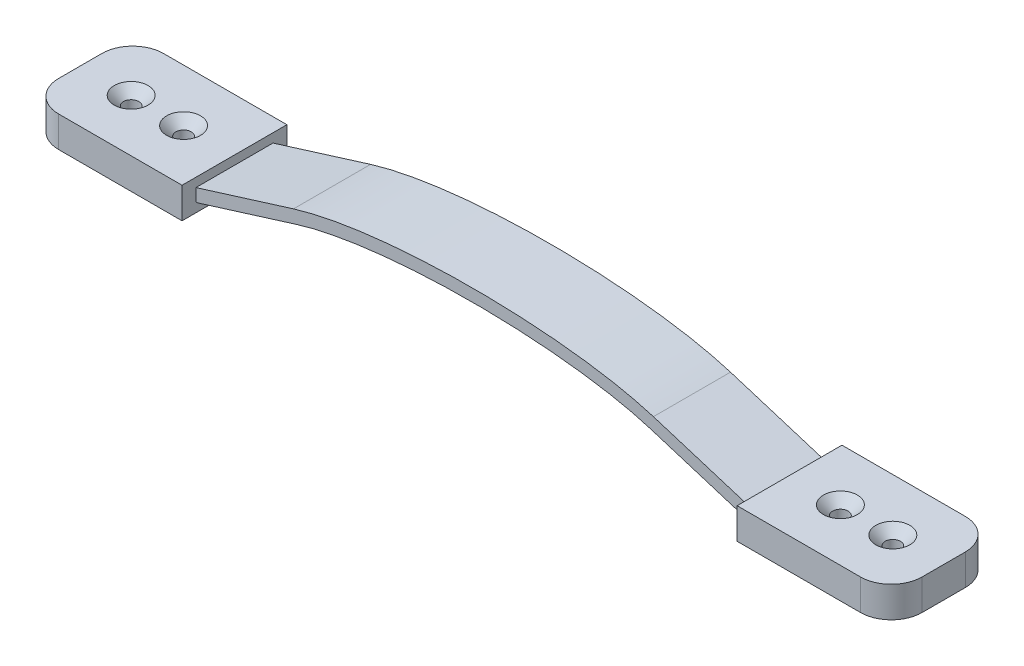
ISO-10303-21;
HEADER;
FILE_DESCRIPTION(('STEP AP214'),'2;1');
FILE_NAME('part.step','',(''),(''),'','','');
FILE_SCHEMA(('AUTOMOTIVE_DESIGN { 1 0 10303 214 1 1 1 1 }'));
ENDSEC;
DATA;
#1=APPLICATION_CONTEXT('core data for automotive mechanical design processes');
#2=APPLICATION_PROTOCOL_DEFINITION('international standard','automotive_design',2000,#1);
#3=PRODUCT_CONTEXT('',#1,'mechanical');
#4=PRODUCT('Part','Part','',(#3));
#5=PRODUCT_RELATED_PRODUCT_CATEGORY('part','',(#4));
#6=PRODUCT_DEFINITION_FORMATION('','',#4);
#7=PRODUCT_DEFINITION_CONTEXT('part definition',#1,'design');
#8=PRODUCT_DEFINITION('design','',#6,#7);
#9=PRODUCT_DEFINITION_SHAPE('','',#8);
#10=(LENGTH_UNIT() NAMED_UNIT(*) SI_UNIT(.MILLI.,.METRE.));
#11=(NAMED_UNIT(*) PLANE_ANGLE_UNIT() SI_UNIT($,.RADIAN.));
#12=(NAMED_UNIT(*) SI_UNIT($,.STERADIAN.) SOLID_ANGLE_UNIT());
#13=UNCERTAINTY_MEASURE_WITH_UNIT(LENGTH_MEASURE(1.E-05),#10,'distance_accuracy_value','');
#14=(GEOMETRIC_REPRESENTATION_CONTEXT(3) GLOBAL_UNCERTAINTY_ASSIGNED_CONTEXT((#13)) GLOBAL_UNIT_ASSIGNED_CONTEXT((#10,
#11,#12)) REPRESENTATION_CONTEXT('',''));
#15=CARTESIAN_POINT('',(0.,0.,0.));
#16=DIRECTION('',(0.,0.,1.));
#17=DIRECTION('',(1.,0.,0.));
#18=AXIS2_PLACEMENT_3D('',#15,#16,#17);
#19=CARTESIAN_POINT('',(50.,10.,0.));
#20=DIRECTION('',(-1.,0.,0.));
#21=DIRECTION('',(0.,0.,1.));
#22=AXIS2_PLACEMENT_3D('',#19,#20,#21);
#23=PLANE('',#22);
#24=DIRECTION('',(0.,0.,-1.));
#25=VECTOR('',#24,1.);
#26=CARTESIAN_POINT('',(50.,0.,0.));
#27=LINE('',#26,#25);
#28=CARTESIAN_POINT('',(50.,0.,0.));
#29=VERTEX_POINT('',#28);
#30=CARTESIAN_POINT('',(50.,0.,-34.));
#31=VERTEX_POINT('',#30);
#32=EDGE_CURVE('E630',#29,#31,#27,.T.);
#33=ORIENTED_EDGE('',*,*,#32,.T.);
#34=DIRECTION('',(0.,-1.,0.));
#35=VECTOR('',#34,1.);
#36=CARTESIAN_POINT('',(50.,10.,-34.));
#37=LINE('',#36,#35);
#38=CARTESIAN_POINT('',(50.,10.,-34.));
#39=VERTEX_POINT('',#38);
#40=EDGE_CURVE('E380',#39,#31,#37,.T.);
#41=ORIENTED_EDGE('',*,*,#40,.F.);
#42=DIRECTION('',(0.,0.,-1.));
#43=VECTOR('',#42,1.);
#44=CARTESIAN_POINT('',(50.,10.,0.));
#45=LINE('',#44,#43);
#46=CARTESIAN_POINT('',(50.,10.,0.));
#47=VERTEX_POINT('',#46);
#48=EDGE_CURVE('E376',#47,#39,#45,.T.);
#49=ORIENTED_EDGE('',*,*,#48,.F.);
#50=DIRECTION('',(0.,-1.,0.));
#51=VECTOR('',#50,1.);
#52=CARTESIAN_POINT('',(50.,10.,0.));
#53=LINE('',#52,#51);
#54=EDGE_CURVE('E638',#47,#29,#53,.T.);
#55=ORIENTED_EDGE('',*,*,#54,.T.);
#56=EDGE_LOOP('',(#33,#41,#49,#55));
#57=FACE_BOUND('',#56,.T.);
#58=DIRECTION('',(0.,1.,0.));
#59=VECTOR('',#58,1.);
#60=CARTESIAN_POINT('',(50.,0.,-29.5));
#61=LINE('',#60,#59);
#62=CARTESIAN_POINT('',(50.,3.0901640808377,-29.5));
#63=VERTEX_POINT('',#62);
#64=CARTESIAN_POINT('',(50.,7.09442076142043,-29.5));
#65=VERTEX_POINT('',#64);
#66=EDGE_CURVE('E62',#63,#65,#61,.T.);
#67=ORIENTED_EDGE('',*,*,#66,.F.);
#68=DIRECTION('',(0.,0.,-1.));
#69=VECTOR('',#68,1.);
#70=CARTESIAN_POINT('',(50.,3.0901640808377,-4.5));
#71=LINE('',#70,#69);
#72=CARTESIAN_POINT('',(50.,3.0901640808377,-4.5));
#73=VERTEX_POINT('',#72);
#74=EDGE_CURVE('E587',#73,#63,#71,.T.);
#75=ORIENTED_EDGE('',*,*,#74,.F.);
#76=DIRECTION('',(0.,1.,0.));
#77=VECTOR('',#76,1.);
#78=CARTESIAN_POINT('',(50.,0.,-4.5));
#79=LINE('',#78,#77);
#80=CARTESIAN_POINT('',(50.,7.09442076142043,-4.5));
#81=VERTEX_POINT('',#80);
#82=EDGE_CURVE('E528',#73,#81,#79,.T.);
#83=ORIENTED_EDGE('',*,*,#82,.T.);
#84=DIRECTION('',(0.,0.,-1.));
#85=VECTOR('',#84,1.);
#86=CARTESIAN_POINT('',(50.,7.09442076142043,-4.5));
#87=LINE('',#86,#85);
#88=EDGE_CURVE('E590',#81,#65,#87,.T.);
#89=ORIENTED_EDGE('',*,*,#88,.T.);
#90=EDGE_LOOP('',(#67,#75,#83,#89));
#91=FACE_BOUND('',#90,.T.);
#92=ADVANCED_FACE('F45',(#57,#91),#23,.F.);
#93=CARTESIAN_POINT('',(0.,10.,0.));
#94=DIRECTION('',(1.,0.,0.));
#95=DIRECTION('',(0.,0.,-1.));
#96=AXIS2_PLACEMENT_3D('',#93,#94,#95);
#97=PLANE('',#96);
#98=DIRECTION('',(0.,0.,1.));
#99=VECTOR('',#98,1.);
#100=CARTESIAN_POINT('',(0.,10.,0.));
#101=LINE('',#100,#99);
#102=CARTESIAN_POINT('',(0.,10.,-24.));
#103=VERTEX_POINT('',#102);
#104=CARTESIAN_POINT('',(0.,10.,-10.));
#105=VERTEX_POINT('',#104);
#106=EDGE_CURVE('E615',#103,#105,#101,.T.);
#107=ORIENTED_EDGE('',*,*,#106,.F.);
#108=DIRECTION('',(0.,-1.,0.));
#109=VECTOR('',#108,1.);
#110=CARTESIAN_POINT('',(0.,10.,-24.));
#111=LINE('',#110,#109);
#112=CARTESIAN_POINT('',(0.,0.,-24.));
#113=VERTEX_POINT('',#112);
#114=EDGE_CURVE('E386',#103,#113,#111,.T.);
#115=ORIENTED_EDGE('',*,*,#114,.T.);
#116=DIRECTION('',(0.,0.,1.));
#117=VECTOR('',#116,1.);
#118=CARTESIAN_POINT('',(0.,0.,0.));
#119=LINE('',#118,#117);
#120=CARTESIAN_POINT('',(0.,0.,-10.));
#121=VERTEX_POINT('',#120);
#122=EDGE_CURVE('E614',#113,#121,#119,.T.);
#123=ORIENTED_EDGE('',*,*,#122,.T.);
#124=DIRECTION('',(0.,-1.,0.));
#125=VECTOR('',#124,1.);
#126=CARTESIAN_POINT('',(0.,10.,-10.));
#127=LINE('',#126,#125);
#128=EDGE_CURVE('E642',#121,#105,#127,.F.);
#129=ORIENTED_EDGE('',*,*,#128,.T.);
#130=EDGE_LOOP('',(#107,#115,#123,#129));
#131=FACE_BOUND('',#130,.T.);
#132=ADVANCED_FACE('F309',(#131),#97,.F.);
#133=CARTESIAN_POINT('',(0.,10.,0.));
#134=DIRECTION('',(0.,0.,-1.));
#135=DIRECTION('',(-1.,0.,0.));
#136=AXIS2_PLACEMENT_3D('',#133,#134,#135);
#137=PLANE('',#136);
#138=DIRECTION('',(1.,0.,0.));
#139=VECTOR('',#138,1.);
#140=CARTESIAN_POINT('',(0.,10.,0.));
#141=LINE('',#140,#139);
#142=CARTESIAN_POINT('',(10.,10.,0.));
#143=VERTEX_POINT('',#142);
#144=EDGE_CURVE('E618',#143,#47,#141,.T.);
#145=ORIENTED_EDGE('',*,*,#144,.F.);
#146=DIRECTION('',(0.,-1.,0.));
#147=VECTOR('',#146,1.);
#148=CARTESIAN_POINT('',(10.,10.,0.));
#149=LINE('',#148,#147);
#150=CARTESIAN_POINT('',(10.,0.,0.));
#151=VERTEX_POINT('',#150);
#152=EDGE_CURVE('E388',#143,#151,#149,.T.);
#153=ORIENTED_EDGE('',*,*,#152,.T.);
#154=DIRECTION('',(1.,0.,0.));
#155=VECTOR('',#154,1.);
#156=CARTESIAN_POINT('',(0.,0.,0.));
#157=LINE('',#156,#155);
#158=EDGE_CURVE('E627',#151,#29,#157,.T.);
#159=ORIENTED_EDGE('',*,*,#158,.T.);
#160=ORIENTED_EDGE('',*,*,#54,.F.);
#161=EDGE_LOOP('',(#145,#153,#159,#160));
#162=FACE_BOUND('',#161,.T.);
#163=ADVANCED_FACE('F305',(#162),#137,.F.);
#164=CARTESIAN_POINT('',(0.,10.,-34.));
#165=DIRECTION('',(0.,0.,1.));
#166=DIRECTION('',(1.,0.,0.));
#167=AXIS2_PLACEMENT_3D('',#164,#165,#166);
#168=PLANE('',#167);
#169=DIRECTION('',(-1.,0.,0.));
#170=VECTOR('',#169,1.);
#171=CARTESIAN_POINT('',(0.,0.,-34.));
#172=LINE('',#171,#170);
#173=CARTESIAN_POINT('',(10.,0.,-34.));
#174=VERTEX_POINT('',#173);
#175=EDGE_CURVE('E619',#31,#174,#172,.T.);
#176=ORIENTED_EDGE('',*,*,#175,.T.);
#177=DIRECTION('',(0.,-1.,0.));
#178=VECTOR('',#177,1.);
#179=CARTESIAN_POINT('',(10.,10.,-34.));
#180=LINE('',#179,#178);
#181=CARTESIAN_POINT('',(10.,10.,-34.));
#182=VERTEX_POINT('',#181);
#183=EDGE_CURVE('E384',#174,#182,#180,.F.);
#184=ORIENTED_EDGE('',*,*,#183,.T.);
#185=DIRECTION('',(-1.,0.,0.));
#186=VECTOR('',#185,1.);
#187=CARTESIAN_POINT('',(0.,10.,-34.));
#188=LINE('',#187,#186);
#189=EDGE_CURVE('E371',#39,#182,#188,.T.);
#190=ORIENTED_EDGE('',*,*,#189,.F.);
#191=ORIENTED_EDGE('',*,*,#40,.T.);
#192=EDGE_LOOP('',(#176,#184,#190,#191));
#193=FACE_BOUND('',#192,.T.);
#194=ADVANCED_FACE('F297',(#193),#168,.F.);
#195=CARTESIAN_POINT('',(0.,10.,0.));
#196=DIRECTION('',(0.,-1.,0.));
#197=DIRECTION('',(0.,0.,-1.));
#198=AXIS2_PLACEMENT_3D('',#195,#196,#197);
#199=PLANE('',#198);
#200=CARTESIAN_POINT('',(33.5,10.,-17.));
#201=DIRECTION('',(0.,-1.,0.));
#202=DIRECTION('',(0.,0.,-1.));
#203=AXIS2_PLACEMENT_3D('',#200,#201,#202);
#204=CIRCLE('',#203,5.49999999999998);
#205=CARTESIAN_POINT('',(33.5,10.,-22.5));
#206=VERTEX_POINT('',#205);
#207=EDGE_CURVE('E55',#206,#206,#204,.T.);
#208=ORIENTED_EDGE('',*,*,#207,.T.);
#209=EDGE_LOOP('',(#208));
#210=FACE_BOUND('',#209,.T.);
#211=CARTESIAN_POINT('',(16.5,10.,-17.));
#212=DIRECTION('',(0.,-1.,0.));
#213=DIRECTION('',(0.,0.,-1.));
#214=AXIS2_PLACEMENT_3D('',#211,#212,#213);
#215=CIRCLE('',#214,5.49999999999998);
#216=CARTESIAN_POINT('',(16.5,10.,-22.5));
#217=VERTEX_POINT('',#216);
#218=EDGE_CURVE('E355',#217,#217,#215,.T.);
#219=ORIENTED_EDGE('',*,*,#218,.T.);
#220=EDGE_LOOP('',(#219));
#221=FACE_BOUND('',#220,.T.);
#222=ORIENTED_EDGE('',*,*,#189,.T.);
#223=CARTESIAN_POINT('',(10.,10.,-24.));
#224=DIRECTION('',(0.,-1.,0.));
#225=DIRECTION('',(0.,0.,-1.));
#226=AXIS2_PLACEMENT_3D('',#223,#224,#225);
#227=CIRCLE('',#226,10.);
#228=EDGE_CURVE('E373',#182,#103,#227,.F.);
#229=ORIENTED_EDGE('',*,*,#228,.T.);
#230=ORIENTED_EDGE('',*,*,#106,.T.);
#231=CARTESIAN_POINT('',(10.,10.,-10.));
#232=DIRECTION('',(0.,-1.,0.));
#233=DIRECTION('',(0.,0.,-1.));
#234=AXIS2_PLACEMENT_3D('',#231,#232,#233);
#235=CIRCLE('',#234,10.);
#236=EDGE_CURVE('E70',#105,#143,#235,.F.);
#237=ORIENTED_EDGE('',*,*,#236,.T.);
#238=ORIENTED_EDGE('',*,*,#144,.T.);
#239=ORIENTED_EDGE('',*,*,#48,.T.);
#240=EDGE_LOOP('',(#222,#229,#230,#237,#238,#239));
#241=FACE_BOUND('',#240,.T.);
#242=ADVANCED_FACE('F293',(#210,#221,#241),#199,.F.);
#243=CARTESIAN_POINT('',(0.,0.,0.));
#244=DIRECTION('',(0.,-1.,0.));
#245=DIRECTION('',(0.,0.,-1.));
#246=AXIS2_PLACEMENT_3D('',#243,#244,#245);
#247=PLANE('',#246);
#248=CARTESIAN_POINT('',(16.5,0.,-17.));
#249=DIRECTION('',(0.,1.,0.));
#250=DIRECTION('',(0.,0.,1.));
#251=AXIS2_PLACEMENT_3D('',#248,#249,#250);
#252=CIRCLE('',#251,2.5);
#253=CARTESIAN_POINT('',(16.5,0.,-14.5));
#254=VERTEX_POINT('',#253);
#255=EDGE_CURVE('E434',#254,#254,#252,.T.);
#256=ORIENTED_EDGE('',*,*,#255,.T.);
#257=EDGE_LOOP('',(#256));
#258=FACE_BOUND('',#257,.T.);
#259=CARTESIAN_POINT('',(33.5,0.,-17.));
#260=DIRECTION('',(0.,1.,0.));
#261=DIRECTION('',(0.,0.,1.));
#262=AXIS2_PLACEMENT_3D('',#259,#260,#261);
#263=CIRCLE('',#262,2.5);
#264=CARTESIAN_POINT('',(33.5,0.,-14.5));
#265=VERTEX_POINT('',#264);
#266=EDGE_CURVE('E443',#265,#265,#263,.T.);
#267=ORIENTED_EDGE('',*,*,#266,.T.);
#268=EDGE_LOOP('',(#267));
#269=FACE_BOUND('',#268,.T.);
#270=ORIENTED_EDGE('',*,*,#122,.F.);
#271=CARTESIAN_POINT('',(10.,0.,-24.));
#272=DIRECTION('',(0.,-1.,0.));
#273=DIRECTION('',(0.,0.,-1.));
#274=AXIS2_PLACEMENT_3D('',#271,#272,#273);
#275=CIRCLE('',#274,10.);
#276=EDGE_CURVE('E650',#113,#174,#275,.T.);
#277=ORIENTED_EDGE('',*,*,#276,.T.);
#278=ORIENTED_EDGE('',*,*,#175,.F.);
#279=ORIENTED_EDGE('',*,*,#32,.F.);
#280=ORIENTED_EDGE('',*,*,#158,.F.);
#281=CARTESIAN_POINT('',(10.,0.,-10.));
#282=DIRECTION('',(0.,-1.,0.));
#283=DIRECTION('',(0.,0.,-1.));
#284=AXIS2_PLACEMENT_3D('',#281,#282,#283);
#285=CIRCLE('',#284,10.);
#286=EDGE_CURVE('E647',#151,#121,#285,.T.);
#287=ORIENTED_EDGE('',*,*,#286,.T.);
#288=EDGE_LOOP('',(#270,#277,#278,#279,#280,#287));
#289=FACE_BOUND('',#288,.T.);
#290=ADVANCED_FACE('F296',(#258,#269,#289),#247,.T.);
#291=CARTESIAN_POINT('',(10.,10.,-24.));
#292=DIRECTION('',(0.,-1.,0.));
#293=DIRECTION('',(0.,0.,-1.));
#294=AXIS2_PLACEMENT_3D('',#291,#292,#293);
#295=CYLINDRICAL_SURFACE('',#294,10.);
#296=ORIENTED_EDGE('',*,*,#228,.F.);
#297=ORIENTED_EDGE('',*,*,#183,.F.);
#298=ORIENTED_EDGE('',*,*,#276,.F.);
#299=ORIENTED_EDGE('',*,*,#114,.F.);
#300=EDGE_LOOP('',(#296,#297,#298,#299));
#301=FACE_BOUND('',#300,.T.);
#302=ADVANCED_FACE('F301',(#301),#295,.T.);
#303=CARTESIAN_POINT('',(10.,10.,-10.));
#304=DIRECTION('',(0.,-1.,0.));
#305=DIRECTION('',(0.,0.,-1.));
#306=AXIS2_PLACEMENT_3D('',#303,#304,#305);
#307=CYLINDRICAL_SURFACE('',#306,10.);
#308=ORIENTED_EDGE('',*,*,#236,.F.);
#309=ORIENTED_EDGE('',*,*,#128,.F.);
#310=ORIENTED_EDGE('',*,*,#286,.F.);
#311=ORIENTED_EDGE('',*,*,#152,.F.);
#312=EDGE_LOOP('',(#308,#309,#310,#311));
#313=FACE_BOUND('',#312,.T.);
#314=ADVANCED_FACE('F290',(#313),#307,.T.);
#315=CARTESIAN_POINT('',(197.1692100105,13.1121845718647,-4.5));
#316=CARTESIAN_POINT('',(196.755159458702,13.240906743082,-4.5));
#317=CARTESIAN_POINT('',(195.935388877368,13.4881018618423,-4.5));
#318=CARTESIAN_POINT('',(194.203464644121,13.9804432271396,-4.5));
#319=CARTESIAN_POINT('',(191.927236958025,14.5726199055289,-4.5));
#320=CARTESIAN_POINT('',(189.009827951021,15.2484009329173,-4.5));
#321=CARTESIAN_POINT('',(184.893205939607,16.0970584378283,-4.5));
#322=CARTESIAN_POINT('',(179.347389143182,17.0538608268824,-4.5));
#323=CARTESIAN_POINT('',(172.148362971745,18.0171976709895,-4.5));
#324=CARTESIAN_POINT('',(164.506098731558,18.781331096827,-4.5));
#325=CARTESIAN_POINT('',(153.86712852881,19.5198722842721,-4.5));
#326=CARTESIAN_POINT('',(140.,19.8959681371454,-4.5));
#327=CARTESIAN_POINT('',(126.13287147119,19.5198722842721,-4.5));
#328=CARTESIAN_POINT('',(115.493901268442,18.781331096827,-4.5));
#329=CARTESIAN_POINT('',(107.851637028255,18.0171976709895,-4.5));
#330=CARTESIAN_POINT('',(100.652610856818,17.0538608268824,-4.5));
#331=CARTESIAN_POINT('',(95.1067940603932,16.0970584378283,-4.5));
#332=CARTESIAN_POINT('',(90.9901720489787,15.2484009329173,-4.5));
#333=CARTESIAN_POINT('',(88.0727630419746,14.5726199055289,-4.5));
#334=CARTESIAN_POINT('',(85.7965353558788,13.9804432271395,-4.5));
#335=CARTESIAN_POINT('',(84.0646111226319,13.4881018618422,-4.5));
#336=CARTESIAN_POINT('',(83.2448405412979,13.240906743082,-4.5));
#337=CARTESIAN_POINT('',(82.8307899895002,13.1121845718647,-4.5));
#338=B_SPLINE_CURVE_WITH_KNOTS('',3,(#315,#316,#317,#318,#319,#320,#321,#322,#323,#324,#325,
#326,#327,#328,#329,#330,#331,#332,#333,#334,#335,#336,#337),.UNSPECIFIED.,.F.,.F.,(4,1,1,1,1,1,
1,1,1,1,1,1,1,1,1,1,1,1,1,1,4),(0.641614074376837,0.670651019764902,0.699687965152966,
0.757761855929095,0.815835746705224,0.873909637481352,0.99005741903361,1.10620520058587,
1.22235298213812,1.33850076369038,1.5707963267949,1.80309188989941,1.91923967145167,
2.03538745300393,2.15153523455618,2.26768301610844,2.32575690688457,2.3838307976607,
2.44190468843683,2.47094163382489,2.49997857921296),.UNSPECIFIED.);
#339=DIRECTION('',(0.,0.,-1.));
#340=VECTOR('',#339,1.);
#341=SURFACE_OF_LINEAR_EXTRUSION('',#338,#340);
#342=CARTESIAN_POINT('',(197.1692100105,13.1121845718647,-29.5));
#343=CARTESIAN_POINT('',(196.755159458702,13.240906743082,-29.5));
#344=CARTESIAN_POINT('',(195.935388877368,13.4881018618423,-29.5));
#345=CARTESIAN_POINT('',(194.203464644121,13.9804432271396,-29.5));
#346=CARTESIAN_POINT('',(191.927236958025,14.5726199055289,-29.5));
#347=CARTESIAN_POINT('',(189.009827951021,15.2484009329173,-29.5));
#348=CARTESIAN_POINT('',(184.893205939607,16.0970584378283,-29.5));
#349=CARTESIAN_POINT('',(179.347389143182,17.0538608268824,-29.5));
#350=CARTESIAN_POINT('',(172.148362971745,18.0171976709895,-29.5));
#351=CARTESIAN_POINT('',(164.506098731558,18.781331096827,-29.5));
#352=CARTESIAN_POINT('',(153.86712852881,19.5198722842721,-29.5));
#353=CARTESIAN_POINT('',(140.,19.8959681371454,-29.5));
#354=CARTESIAN_POINT('',(126.13287147119,19.5198722842721,-29.5));
#355=CARTESIAN_POINT('',(115.493901268442,18.781331096827,-29.5));
#356=CARTESIAN_POINT('',(107.851637028255,18.0171976709895,-29.5));
#357=CARTESIAN_POINT('',(100.652610856818,17.0538608268824,-29.5));
#358=CARTESIAN_POINT('',(95.1067940603932,16.0970584378283,-29.5));
#359=CARTESIAN_POINT('',(90.9901720489787,15.2484009329173,-29.5));
#360=CARTESIAN_POINT('',(88.0727630419746,14.5726199055289,-29.5));
#361=CARTESIAN_POINT('',(85.7965353558788,13.9804432271395,-29.5));
#362=CARTESIAN_POINT('',(84.0646111226319,13.4881018618422,-29.5));
#363=CARTESIAN_POINT('',(83.2448405412979,13.240906743082,-29.5));
#364=CARTESIAN_POINT('',(82.8307899895002,13.1121845718647,-29.5));
#365=B_SPLINE_CURVE_WITH_KNOTS('',3,(#342,#343,#344,#345,#346,#347,#348,#349,#350,#351,#352,
#353,#354,#355,#356,#357,#358,#359,#360,#361,#362,#363,#364),.UNSPECIFIED.,.F.,.F.,(4,1,1,1,1,1,
1,1,1,1,1,1,1,1,1,1,1,1,1,1,4),(0.641614074376837,0.670651019764902,0.699687965152966,
0.757761855929095,0.815835746705224,0.873909637481352,0.99005741903361,1.10620520058587,
1.22235298213812,1.33850076369038,1.5707963267949,1.80309188989941,1.91923967145167,
2.03538745300393,2.15153523455618,2.26768301610844,2.32575690688457,2.3838307976607,
2.44190468843683,2.47094163382489,2.49997857921296),.UNSPECIFIED.);
#366=CARTESIAN_POINT('',(197.1692100105,13.1121845718647,-29.5));
#367=VERTEX_POINT('',#366);
#368=CARTESIAN_POINT('',(82.8307899895002,13.1121845718647,-29.5));
#369=VERTEX_POINT('',#368);
#370=EDGE_CURVE('E270',#367,#369,#365,.T.);
#371=ORIENTED_EDGE('',*,*,#370,.F.);
#372=DIRECTION('',(0.,0.,-1.));
#373=VECTOR('',#372,1.);
#374=CARTESIAN_POINT('',(197.1692100105,13.1121845718647,-4.5));
#375=LINE('',#374,#373);
#376=CARTESIAN_POINT('',(197.1692100105,13.1121845718647,-4.5));
#377=VERTEX_POINT('',#376);
#378=EDGE_CURVE('E611',#377,#367,#375,.T.);
#379=ORIENTED_EDGE('',*,*,#378,.F.);
#380=CARTESIAN_POINT('',(82.8307899895002,13.1121845718647,-4.5));
#381=VERTEX_POINT('',#380);
#382=EDGE_CURVE('E271',#377,#381,#338,.T.);
#383=ORIENTED_EDGE('',*,*,#382,.T.);
#384=DIRECTION('',(0.,0.,-1.));
#385=VECTOR('',#384,1.);
#386=CARTESIAN_POINT('',(82.8307899895002,13.1121845718647,-4.5));
#387=LINE('',#386,#385);
#388=EDGE_CURVE('E539',#381,#369,#387,.T.);
#389=ORIENTED_EDGE('',*,*,#388,.T.);
#390=EDGE_LOOP('',(#371,#379,#383,#389));
#391=FACE_BOUND('',#390,.T.);
#392=ADVANCED_FACE('F285',(#391),#341,.T.);
#393=CARTESIAN_POINT('',(21.093980783901,67.8513600305837,-4.5));
#394=DIRECTION('',(0.296869820745338,0.954917959581152,0.));
#395=DIRECTION('',(-0.954917959581152,0.296869820745338,0.));
#396=AXIS2_PLACEMENT_3D('',#393,#394,#395);
#397=PLANE('',#396);
#398=DIRECTION('',(0.954917959581152,-0.296869820745338,0.));
#399=VECTOR('',#398,1.);
#400=CARTESIAN_POINT('',(21.093980783901,67.8513600305837,-29.5));
#401=LINE('',#400,#399);
#402=CARTESIAN_POINT('',(229.406260358509,3.09016408083769,-29.5));
#403=VERTEX_POINT('',#402);
#404=EDGE_CURVE('E545',#367,#403,#401,.T.);
#405=ORIENTED_EDGE('',*,*,#404,.T.);
#406=DIRECTION('',(0.,0.,-1.));
#407=VECTOR('',#406,1.);
#408=CARTESIAN_POINT('',(229.406260358509,3.09016408083769,-4.5));
#409=LINE('',#408,#407);
#410=CARTESIAN_POINT('',(229.406260358509,3.09016408083769,-4.5));
#411=VERTEX_POINT('',#410);
#412=EDGE_CURVE('E607',#411,#403,#409,.T.);
#413=ORIENTED_EDGE('',*,*,#412,.F.);
#414=DIRECTION('',(0.954917959581152,-0.296869820745338,0.));
#415=VECTOR('',#414,1.);
#416=CARTESIAN_POINT('',(21.093980783901,67.8513600305837,-4.5));
#417=LINE('',#416,#415);
#418=EDGE_CURVE('E278',#377,#411,#417,.T.);
#419=ORIENTED_EDGE('',*,*,#418,.F.);
#420=ORIENTED_EDGE('',*,*,#378,.T.);
#421=EDGE_LOOP('',(#405,#413,#419,#420));
#422=FACE_BOUND('',#421,.T.);
#423=ADVANCED_FACE('F289',(#422),#397,.F.);
#424=CARTESIAN_POINT('',(0.,3.09016408083753,-4.5));
#425=DIRECTION('',(0.,1.,0.));
#426=DIRECTION('',(-1.,0.,0.));
#427=AXIS2_PLACEMENT_3D('',#424,#425,#426);
#428=PLANE('',#427);
#429=DIRECTION('',(1.,0.,0.));
#430=VECTOR('',#429,1.);
#431=CARTESIAN_POINT('',(0.,3.09016408083753,-29.5));
#432=LINE('',#431,#430);
#433=CARTESIAN_POINT('',(230.,3.0901640808377,-29.5));
#434=VERTEX_POINT('',#433);
#435=EDGE_CURVE('E551',#403,#434,#432,.T.);
#436=ORIENTED_EDGE('',*,*,#435,.T.);
#437=DIRECTION('',(0.,0.,-1.));
#438=VECTOR('',#437,1.);
#439=CARTESIAN_POINT('',(230.,3.0901640808377,-4.5));
#440=LINE('',#439,#438);
#441=CARTESIAN_POINT('',(230.,3.0901640808377,-4.5));
#442=VERTEX_POINT('',#441);
#443=EDGE_CURVE('E603',#442,#434,#440,.T.);
#444=ORIENTED_EDGE('',*,*,#443,.F.);
#445=DIRECTION('',(1.,0.,0.));
#446=VECTOR('',#445,1.);
#447=CARTESIAN_POINT('',(0.,3.09016408083753,-4.5));
#448=LINE('',#447,#446);
#449=EDGE_CURVE('E682',#411,#442,#448,.T.);
#450=ORIENTED_EDGE('',*,*,#449,.F.);
#451=ORIENTED_EDGE('',*,*,#412,.T.);
#452=EDGE_LOOP('',(#436,#444,#450,#451));
#453=FACE_BOUND('',#452,.T.);
#454=ADVANCED_FACE('F687',(#453),#428,.F.);
#455=CARTESIAN_POINT('',(22.2814600668823,71.6710318689083,-4.5));
#456=DIRECTION('',(0.296869820745338,0.954917959581152,0.));
#457=DIRECTION('',(-0.954917959581152,0.296869820745338,0.));
#458=AXIS2_PLACEMENT_3D('',#455,#456,#457);
#459=PLANE('',#458);
#460=DIRECTION('',(0.954917959581152,-0.296869820745338,0.));
#461=VECTOR('',#460,1.);
#462=CARTESIAN_POINT('',(22.2814600668823,71.6710318689083,-29.5));
#463=LINE('',#462,#461);
#464=CARTESIAN_POINT('',(198.356689293481,16.9318564101894,-29.5));
#465=VERTEX_POINT('',#464);
#466=CARTESIAN_POINT('',(230.,7.09442076142043,-29.5));
#467=VERTEX_POINT('',#466);
#468=EDGE_CURVE('E558',#465,#467,#463,.T.);
#469=ORIENTED_EDGE('',*,*,#468,.F.);
#470=DIRECTION('',(0.,0.,-1.));
#471=VECTOR('',#470,1.);
#472=CARTESIAN_POINT('',(198.356689293481,16.9318564101894,-4.5));
#473=LINE('',#472,#471);
#474=CARTESIAN_POINT('',(198.356689293481,16.9318564101894,-4.5));
#475=VERTEX_POINT('',#474);
#476=EDGE_CURVE('E597',#475,#465,#473,.T.);
#477=ORIENTED_EDGE('',*,*,#476,.F.);
#478=DIRECTION('',(0.954917959581152,-0.296869820745338,0.));
#479=VECTOR('',#478,1.);
#480=CARTESIAN_POINT('',(22.2814600668823,71.6710318689083,-4.5));
#481=LINE('',#480,#479);
#482=CARTESIAN_POINT('',(230.,7.09442076142043,-4.5));
#483=VERTEX_POINT('',#482);
#484=EDGE_CURVE('E520',#475,#483,#481,.T.);
#485=ORIENTED_EDGE('',*,*,#484,.T.);
#486=DIRECTION('',(0.,0.,-1.));
#487=VECTOR('',#486,1.);
#488=CARTESIAN_POINT('',(230.,7.09442076142043,-4.5));
#489=LINE('',#488,#487);
#490=EDGE_CURVE('E600',#483,#467,#489,.T.);
#491=ORIENTED_EDGE('',*,*,#490,.T.);
#492=EDGE_LOOP('',(#469,#477,#485,#491));
#493=FACE_BOUND('',#492,.T.);
#494=ADVANCED_FACE('F510',(#493),#459,.T.);
#495=CARTESIAN_POINT('',(198.356689293481,16.9318564101893,-4.5));
#496=CARTESIAN_POINT('',(197.921485468098,17.0671548202075,-4.5));
#497=CARTESIAN_POINT('',(197.058320029096,17.3274308819559,-4.5));
#498=CARTESIAN_POINT('',(195.247018989167,17.8422836937597,-4.5));
#499=CARTESIAN_POINT('',(192.878899734469,18.4582592907681,-4.5));
#500=CARTESIAN_POINT('',(189.862315722231,19.1569016412667,-4.5));
#501=CARTESIAN_POINT('',(185.625111362429,20.0303109348515,-4.5));
#502=CARTESIAN_POINT('',(179.946744847819,21.0096373570037,-4.5));
#503=CARTESIAN_POINT('',(172.608544526039,21.9913717882007,-4.5));
#504=CARTESIAN_POINT('',(164.840841870468,22.7679089573726,-4.5));
#505=CARTESIAN_POINT('',(154.046889349405,23.5170830164828,-4.5));
#506=CARTESIAN_POINT('',(140.,23.8978276490049,-4.5));
#507=CARTESIAN_POINT('',(125.953110650595,23.5170830164828,-4.5));
#508=CARTESIAN_POINT('',(115.159158129532,22.7679089573726,-4.5));
#509=CARTESIAN_POINT('',(107.391455473961,21.9913717882007,-4.5));
#510=CARTESIAN_POINT('',(100.053255152181,21.0096373570037,-4.5));
#511=CARTESIAN_POINT('',(94.3748886375706,20.0303109348515,-4.5));
#512=CARTESIAN_POINT('',(90.1376842777691,19.1569016412667,-4.5));
#513=CARTESIAN_POINT('',(87.1211002655314,18.458259290768,-4.5));
#514=CARTESIAN_POINT('',(84.7529810108328,17.8422836937596,-4.5));
#515=CARTESIAN_POINT('',(82.9416799709036,17.3274308819558,-4.5));
#516=CARTESIAN_POINT('',(82.0785145319019,17.0671548202075,-4.5));
#517=CARTESIAN_POINT('',(81.6433107065189,16.9318564101893,-4.5));
#518=B_SPLINE_CURVE_WITH_KNOTS('',3,(#495,#496,#497,#498,#499,#500,#501,#502,#503,#504,#505,
#506,#507,#508,#509,#510,#511,#512,#513,#514,#515,#516,#517),.UNSPECIFIED.,.F.,.F.,(4,1,1,1,1,1,
1,1,1,1,1,1,1,1,1,1,1,1,1,1,4),(0.641614074376837,0.670651019764902,0.699687965152966,
0.757761855929095,0.815835746705224,0.873909637481352,0.99005741903361,1.10620520058587,
1.22235298213812,1.33850076369038,1.5707963267949,1.80309188989941,1.91923967145167,
2.03538745300393,2.15153523455618,2.26768301610844,2.32575690688457,2.3838307976607,
2.44190468843683,2.47094163382489,2.49997857921296),.UNSPECIFIED.);
#519=DIRECTION('',(0.,0.,-1.));
#520=VECTOR('',#519,1.);
#521=SURFACE_OF_LINEAR_EXTRUSION('',#518,#520);
#522=CARTESIAN_POINT('',(198.356689293481,16.9318564101893,-29.5));
#523=CARTESIAN_POINT('',(197.921485468098,17.0671548202075,-29.5));
#524=CARTESIAN_POINT('',(197.058320029096,17.3274308819559,-29.5));
#525=CARTESIAN_POINT('',(195.247018989167,17.8422836937597,-29.5));
#526=CARTESIAN_POINT('',(192.878899734469,18.4582592907681,-29.5));
#527=CARTESIAN_POINT('',(189.862315722231,19.1569016412667,-29.5));
#528=CARTESIAN_POINT('',(185.625111362429,20.0303109348515,-29.5));
#529=CARTESIAN_POINT('',(179.946744847819,21.0096373570037,-29.5));
#530=CARTESIAN_POINT('',(172.608544526039,21.9913717882007,-29.5));
#531=CARTESIAN_POINT('',(164.840841870468,22.7679089573726,-29.5));
#532=CARTESIAN_POINT('',(154.046889349405,23.5170830164828,-29.5));
#533=CARTESIAN_POINT('',(140.,23.8978276490049,-29.5));
#534=CARTESIAN_POINT('',(125.953110650595,23.5170830164828,-29.5));
#535=CARTESIAN_POINT('',(115.159158129532,22.7679089573726,-29.5));
#536=CARTESIAN_POINT('',(107.391455473961,21.9913717882007,-29.5));
#537=CARTESIAN_POINT('',(100.053255152181,21.0096373570037,-29.5));
#538=CARTESIAN_POINT('',(94.3748886375706,20.0303109348515,-29.5));
#539=CARTESIAN_POINT('',(90.1376842777691,19.1569016412667,-29.5));
#540=CARTESIAN_POINT('',(87.1211002655314,18.458259290768,-29.5));
#541=CARTESIAN_POINT('',(84.7529810108328,17.8422836937596,-29.5));
#542=CARTESIAN_POINT('',(82.9416799709036,17.3274308819558,-29.5));
#543=CARTESIAN_POINT('',(82.0785145319019,17.0671548202075,-29.5));
#544=CARTESIAN_POINT('',(81.6433107065189,16.9318564101893,-29.5));
#545=B_SPLINE_CURVE_WITH_KNOTS('',3,(#522,#523,#524,#525,#526,#527,#528,#529,#530,#531,#532,
#533,#534,#535,#536,#537,#538,#539,#540,#541,#542,#543,#544),.UNSPECIFIED.,.F.,.F.,(4,1,1,1,1,1,
1,1,1,1,1,1,1,1,1,1,1,1,1,1,4),(0.641614074376837,0.670651019764902,0.699687965152966,
0.757761855929095,0.815835746705224,0.873909637481352,0.99005741903361,1.10620520058587,
1.22235298213812,1.33850076369038,1.5707963267949,1.80309188989941,1.91923967145167,
2.03538745300393,2.15153523455618,2.26768301610844,2.32575690688457,2.3838307976607,
2.44190468843683,2.47094163382489,2.49997857921296),.UNSPECIFIED.);
#546=CARTESIAN_POINT('',(81.6433107065189,16.9318564101893,-29.5));
#547=VERTEX_POINT('',#546);
#548=EDGE_CURVE('E562',#465,#547,#545,.T.);
#549=ORIENTED_EDGE('',*,*,#548,.T.);
#550=DIRECTION('',(0.,0.,-1.));
#551=VECTOR('',#550,1.);
#552=CARTESIAN_POINT('',(81.6433107065189,16.9318564101893,-4.5));
#553=LINE('',#552,#551);
#554=CARTESIAN_POINT('',(81.6433107065189,16.9318564101893,-4.5));
#555=VERTEX_POINT('',#554);
#556=EDGE_CURVE('E594',#555,#547,#553,.T.);
#557=ORIENTED_EDGE('',*,*,#556,.F.);
#558=EDGE_CURVE('E512',#475,#555,#518,.T.);
#559=ORIENTED_EDGE('',*,*,#558,.F.);
#560=ORIENTED_EDGE('',*,*,#476,.T.);
#561=EDGE_LOOP('',(#549,#557,#559,#560));
#562=FACE_BOUND('',#561,.T.);
#563=ADVANCED_FACE('F505',(#562),#521,.F.);
#564=CARTESIAN_POINT('',(2.39541326454096,-7.70513870755254,-4.5));
#565=DIRECTION('',(-0.296869820745337,0.954917959581152,0.));
#566=DIRECTION('',(-0.954917959581152,-0.296869820745337,0.));
#567=AXIS2_PLACEMENT_3D('',#564,#565,#566);
#568=PLANE('',#567);
#569=DIRECTION('',(0.954917959581152,0.296869820745337,0.));
#570=VECTOR('',#569,1.);
#571=CARTESIAN_POINT('',(2.39541326454096,-7.70513870755254,-29.5));
#572=LINE('',#571,#570);
#573=EDGE_CURVE('E568',#65,#547,#572,.T.);
#574=ORIENTED_EDGE('',*,*,#573,.F.);
#575=ORIENTED_EDGE('',*,*,#88,.F.);
#576=DIRECTION('',(0.954917959581152,0.296869820745337,0.));
#577=VECTOR('',#576,1.);
#578=CARTESIAN_POINT('',(2.39541326454096,-7.70513870755254,-4.5));
#579=LINE('',#578,#577);
#580=EDGE_CURVE('E519',#81,#555,#579,.T.);
#581=ORIENTED_EDGE('',*,*,#580,.T.);
#582=ORIENTED_EDGE('',*,*,#556,.T.);
#583=EDGE_LOOP('',(#574,#575,#581,#582));
#584=FACE_BOUND('',#583,.T.);
#585=ADVANCED_FACE('F501',(#584),#568,.T.);
#586=CARTESIAN_POINT('',(0.,3.0901640808377,-4.5));
#587=DIRECTION('',(0.,-1.,0.));
#588=DIRECTION('',(0.,0.,-1.));
#589=AXIS2_PLACEMENT_3D('',#586,#587,#588);
#590=PLANE('',#589);
#591=DIRECTION('',(-1.,0.,0.));
#592=VECTOR('',#591,1.);
#593=CARTESIAN_POINT('',(0.,3.0901640808377,-29.5));
#594=LINE('',#593,#592);
#595=CARTESIAN_POINT('',(50.5937396414907,3.0901640808377,-29.5));
#596=VERTEX_POINT('',#595);
#597=EDGE_CURVE('E576',#596,#63,#594,.T.);
#598=ORIENTED_EDGE('',*,*,#597,.F.);
#599=DIRECTION('',(0.,0.,-1.));
#600=VECTOR('',#599,1.);
#601=CARTESIAN_POINT('',(50.5937396414907,3.0901640808377,-4.5));
#602=LINE('',#601,#600);
#603=CARTESIAN_POINT('',(50.5937396414907,3.0901640808377,-4.5));
#604=VERTEX_POINT('',#603);
#605=EDGE_CURVE('E584',#604,#596,#602,.T.);
#606=ORIENTED_EDGE('',*,*,#605,.F.);
#607=DIRECTION('',(-1.,0.,0.));
#608=VECTOR('',#607,1.);
#609=CARTESIAN_POINT('',(0.,3.0901640808377,-4.5));
#610=LINE('',#609,#608);
#611=EDGE_CURVE('E532',#604,#73,#610,.T.);
#612=ORIENTED_EDGE('',*,*,#611,.T.);
#613=ORIENTED_EDGE('',*,*,#74,.T.);
#614=EDGE_LOOP('',(#598,#606,#612,#613));
#615=FACE_BOUND('',#614,.T.);
#616=ADVANCED_FACE('F497',(#615),#590,.T.);
#617=CARTESIAN_POINT('',(3.58289254752231,-11.5248105458772,-4.5));
#618=DIRECTION('',(-0.296869820745337,0.954917959581152,0.));
#619=DIRECTION('',(-0.954917959581152,-0.296869820745337,0.));
#620=AXIS2_PLACEMENT_3D('',#617,#618,#619);
#621=PLANE('',#620);
#622=DIRECTION('',(0.954917959581152,0.296869820745337,0.));
#623=VECTOR('',#622,1.);
#624=CARTESIAN_POINT('',(3.58289254752231,-11.5248105458772,-29.5));
#625=LINE('',#624,#623);
#626=EDGE_CURVE('E279',#596,#369,#625,.T.);
#627=ORIENTED_EDGE('',*,*,#626,.T.);
#628=ORIENTED_EDGE('',*,*,#388,.F.);
#629=DIRECTION('',(0.954917959581152,0.296869820745337,0.));
#630=VECTOR('',#629,1.);
#631=CARTESIAN_POINT('',(3.58289254752231,-11.5248105458772,-4.5));
#632=LINE('',#631,#630);
#633=EDGE_CURVE('E536',#604,#381,#632,.T.);
#634=ORIENTED_EDGE('',*,*,#633,.F.);
#635=ORIENTED_EDGE('',*,*,#605,.T.);
#636=EDGE_LOOP('',(#627,#628,#634,#635));
#637=FACE_BOUND('',#636,.T.);
#638=ADVANCED_FACE('F491',(#637),#621,.F.);
#639=CARTESIAN_POINT('',(0.,0.,-4.5));
#640=DIRECTION('',(0.,0.,1.));
#641=DIRECTION('',(1.,0.,0.));
#642=AXIS2_PLACEMENT_3D('',#639,#640,#641);
#643=PLANE('',#642);
#644=ORIENTED_EDGE('',*,*,#382,.F.);
#645=ORIENTED_EDGE('',*,*,#418,.T.);
#646=ORIENTED_EDGE('',*,*,#449,.T.);
#647=DIRECTION('',(0.,-1.,0.));
#648=VECTOR('',#647,1.);
#649=CARTESIAN_POINT('',(230.,0.,-4.5));
#650=LINE('',#649,#648);
#651=EDGE_CURVE('E690',#483,#442,#650,.T.);
#652=ORIENTED_EDGE('',*,*,#651,.F.);
#653=ORIENTED_EDGE('',*,*,#484,.F.);
#654=ORIENTED_EDGE('',*,*,#558,.T.);
#655=ORIENTED_EDGE('',*,*,#580,.F.);
#656=ORIENTED_EDGE('',*,*,#82,.F.);
#657=ORIENTED_EDGE('',*,*,#611,.F.);
#658=ORIENTED_EDGE('',*,*,#633,.T.);
#659=EDGE_LOOP('',(#644,#645,#646,#652,#653,#654,#655,#656,#657,#658));
#660=FACE_BOUND('',#659,.T.);
#661=ADVANCED_FACE('F488',(#660),#643,.T.);
#662=CARTESIAN_POINT('',(0.,0.,-29.5));
#663=DIRECTION('',(0.,0.,1.));
#664=DIRECTION('',(1.,0.,0.));
#665=AXIS2_PLACEMENT_3D('',#662,#663,#664);
#666=PLANE('',#665);
#667=ORIENTED_EDGE('',*,*,#370,.T.);
#668=ORIENTED_EDGE('',*,*,#626,.F.);
#669=ORIENTED_EDGE('',*,*,#597,.T.);
#670=ORIENTED_EDGE('',*,*,#66,.T.);
#671=ORIENTED_EDGE('',*,*,#573,.T.);
#672=ORIENTED_EDGE('',*,*,#548,.F.);
#673=ORIENTED_EDGE('',*,*,#468,.T.);
#674=DIRECTION('',(0.,-1.,0.));
#675=VECTOR('',#674,1.);
#676=CARTESIAN_POINT('',(230.,0.,-29.5));
#677=LINE('',#676,#675);
#678=EDGE_CURVE('E555',#467,#434,#677,.T.);
#679=ORIENTED_EDGE('',*,*,#678,.T.);
#680=ORIENTED_EDGE('',*,*,#435,.F.);
#681=ORIENTED_EDGE('',*,*,#404,.F.);
#682=EDGE_LOOP('',(#667,#668,#669,#670,#671,#672,#673,#679,#680,#681));
#683=FACE_BOUND('',#682,.T.);
#684=ADVANCED_FACE('F471',(#683),#666,.F.);
#685=CARTESIAN_POINT('',(230.,10.,-34.));
#686=DIRECTION('',(1.,0.,0.));
#687=DIRECTION('',(0.,0.,-1.));
#688=AXIS2_PLACEMENT_3D('',#685,#686,#687);
#689=PLANE('',#688);
#690=ORIENTED_EDGE('',*,*,#678,.F.);
#691=ORIENTED_EDGE('',*,*,#490,.F.);
#692=ORIENTED_EDGE('',*,*,#651,.T.);
#693=ORIENTED_EDGE('',*,*,#443,.T.);
#694=EDGE_LOOP('',(#690,#691,#692,#693));
#695=FACE_BOUND('',#694,.T.);
#696=DIRECTION('',(0.,0.,1.));
#697=VECTOR('',#696,1.);
#698=CARTESIAN_POINT('',(230.,0.,-34.));
#699=LINE('',#698,#697);
#700=CARTESIAN_POINT('',(230.,0.,-34.));
#701=VERTEX_POINT('',#700);
#702=CARTESIAN_POINT('',(230.,0.,0.));
#703=VERTEX_POINT('',#702);
#704=EDGE_CURVE('E218',#701,#703,#699,.T.);
#705=ORIENTED_EDGE('',*,*,#704,.T.);
#706=DIRECTION('',(0.,-1.,0.));
#707=VECTOR('',#706,1.);
#708=CARTESIAN_POINT('',(230.,10.,0.));
#709=LINE('',#708,#707);
#710=CARTESIAN_POINT('',(230.,10.,0.));
#711=VERTEX_POINT('',#710);
#712=EDGE_CURVE('E222',#711,#703,#709,.T.);
#713=ORIENTED_EDGE('',*,*,#712,.F.);
#714=DIRECTION('',(0.,0.,1.));
#715=VECTOR('',#714,1.);
#716=CARTESIAN_POINT('',(230.,10.,-34.));
#717=LINE('',#716,#715);
#718=CARTESIAN_POINT('',(230.,10.,-34.));
#719=VERTEX_POINT('',#718);
#720=EDGE_CURVE('E212',#719,#711,#717,.T.);
#721=ORIENTED_EDGE('',*,*,#720,.F.);
#722=DIRECTION('',(0.,-1.,0.));
#723=VECTOR('',#722,1.);
#724=CARTESIAN_POINT('',(230.,10.,-34.));
#725=LINE('',#724,#723);
#726=EDGE_CURVE('E204',#719,#701,#725,.T.);
#727=ORIENTED_EDGE('',*,*,#726,.T.);
#728=EDGE_LOOP('',(#705,#713,#721,#727));
#729=FACE_BOUND('',#728,.T.);
#730=ADVANCED_FACE('F216',(#695,#729),#689,.F.);
#731=CARTESIAN_POINT('',(230.,10.,0.));
#732=DIRECTION('',(0.,0.,-1.));
#733=DIRECTION('',(-1.,0.,0.));
#734=AXIS2_PLACEMENT_3D('',#731,#732,#733);
#735=PLANE('',#734);
#736=DIRECTION('',(1.,0.,0.));
#737=VECTOR('',#736,1.);
#738=CARTESIAN_POINT('',(230.,0.,0.));
#739=LINE('',#738,#737);
#740=CARTESIAN_POINT('',(270.,0.,0.));
#741=VERTEX_POINT('',#740);
#742=EDGE_CURVE('E226',#703,#741,#739,.T.);
#743=ORIENTED_EDGE('',*,*,#742,.T.);
#744=DIRECTION('',(0.,-1.,0.));
#745=VECTOR('',#744,1.);
#746=CARTESIAN_POINT('',(270.,10.,0.));
#747=LINE('',#746,#745);
#748=CARTESIAN_POINT('',(270.,10.,0.));
#749=VERTEX_POINT('',#748);
#750=EDGE_CURVE('E267',#741,#749,#747,.F.);
#751=ORIENTED_EDGE('',*,*,#750,.T.);
#752=DIRECTION('',(1.,0.,0.));
#753=VECTOR('',#752,1.);
#754=CARTESIAN_POINT('',(230.,10.,0.));
#755=LINE('',#754,#753);
#756=EDGE_CURVE('E243',#711,#749,#755,.T.);
#757=ORIENTED_EDGE('',*,*,#756,.F.);
#758=ORIENTED_EDGE('',*,*,#712,.T.);
#759=EDGE_LOOP('',(#743,#751,#757,#758));
#760=FACE_BOUND('',#759,.T.);
#761=ADVANCED_FACE('F470',(#760),#735,.F.);
#762=CARTESIAN_POINT('',(280.,10.,-34.));
#763=DIRECTION('',(-1.,0.,0.));
#764=DIRECTION('',(0.,0.,1.));
#765=AXIS2_PLACEMENT_3D('',#762,#763,#764);
#766=PLANE('',#765);
#767=DIRECTION('',(0.,0.,-1.));
#768=VECTOR('',#767,1.);
#769=CARTESIAN_POINT('',(280.,0.,-34.));
#770=LINE('',#769,#768);
#771=CARTESIAN_POINT('',(280.,0.,-10.));
#772=VERTEX_POINT('',#771);
#773=CARTESIAN_POINT('',(280.,0.,-24.));
#774=VERTEX_POINT('',#773);
#775=EDGE_CURVE('E211',#772,#774,#770,.T.);
#776=ORIENTED_EDGE('',*,*,#775,.T.);
#777=DIRECTION('',(0.,-1.,0.));
#778=VECTOR('',#777,1.);
#779=CARTESIAN_POINT('',(280.,10.,-24.));
#780=LINE('',#779,#778);
#781=CARTESIAN_POINT('',(280.,10.,-24.));
#782=VERTEX_POINT('',#781);
#783=EDGE_CURVE('E258',#774,#782,#780,.F.);
#784=ORIENTED_EDGE('',*,*,#783,.T.);
#785=DIRECTION('',(0.,0.,-1.));
#786=VECTOR('',#785,1.);
#787=CARTESIAN_POINT('',(280.,10.,-34.));
#788=LINE('',#787,#786);
#789=CARTESIAN_POINT('',(280.,10.,-10.));
#790=VERTEX_POINT('',#789);
#791=EDGE_CURVE('E239',#790,#782,#788,.T.);
#792=ORIENTED_EDGE('',*,*,#791,.F.);
#793=DIRECTION('',(0.,-1.,0.));
#794=VECTOR('',#793,1.);
#795=CARTESIAN_POINT('',(280.,10.,-10.));
#796=LINE('',#795,#794);
#797=EDGE_CURVE('E254',#790,#772,#796,.T.);
#798=ORIENTED_EDGE('',*,*,#797,.T.);
#799=EDGE_LOOP('',(#776,#784,#792,#798));
#800=FACE_BOUND('',#799,.T.);
#801=ADVANCED_FACE('F429',(#800),#766,.F.);
#802=CARTESIAN_POINT('',(230.,10.,-34.));
#803=DIRECTION('',(0.,0.,1.));
#804=DIRECTION('',(1.,0.,0.));
#805=AXIS2_PLACEMENT_3D('',#802,#803,#804);
#806=PLANE('',#805);
#807=DIRECTION('',(-1.,0.,0.));
#808=VECTOR('',#807,1.);
#809=CARTESIAN_POINT('',(230.,10.,-34.));
#810=LINE('',#809,#808);
#811=CARTESIAN_POINT('',(270.,10.,-34.));
#812=VERTEX_POINT('',#811);
#813=EDGE_CURVE('E221',#812,#719,#810,.T.);
#814=ORIENTED_EDGE('',*,*,#813,.F.);
#815=DIRECTION('',(0.,-1.,0.));
#816=VECTOR('',#815,1.);
#817=CARTESIAN_POINT('',(270.,10.,-34.));
#818=LINE('',#817,#816);
#819=CARTESIAN_POINT('',(270.,0.,-34.));
#820=VERTEX_POINT('',#819);
#821=EDGE_CURVE('E207',#812,#820,#818,.T.);
#822=ORIENTED_EDGE('',*,*,#821,.T.);
#823=DIRECTION('',(-1.,0.,0.));
#824=VECTOR('',#823,1.);
#825=CARTESIAN_POINT('',(230.,0.,-34.));
#826=LINE('',#825,#824);
#827=EDGE_CURVE('E200',#820,#701,#826,.T.);
#828=ORIENTED_EDGE('',*,*,#827,.T.);
#829=ORIENTED_EDGE('',*,*,#726,.F.);
#830=EDGE_LOOP('',(#814,#822,#828,#829));
#831=FACE_BOUND('',#830,.T.);
#832=ADVANCED_FACE('F203',(#831),#806,.F.);
#833=CARTESIAN_POINT('',(0.,10.,0.));
#834=DIRECTION('',(0.,1.,0.));
#835=DIRECTION('',(0.,0.,1.));
#836=AXIS2_PLACEMENT_3D('',#833,#834,#835);
#837=PLANE('',#836);
#838=CARTESIAN_POINT('',(263.5,10.,-17.0000000000006));
#839=DIRECTION('',(0.,1.,0.));
#840=DIRECTION('',(0.,0.,1.));
#841=AXIS2_PLACEMENT_3D('',#838,#839,#840);
#842=CIRCLE('',#841,5.50000000000003);
#843=CARTESIAN_POINT('',(263.5,10.,-11.5000000000005));
#844=VERTEX_POINT('',#843);
#845=EDGE_CURVE('E401',#844,#844,#842,.F.);
#846=ORIENTED_EDGE('',*,*,#845,.T.);
#847=EDGE_LOOP('',(#846));
#848=FACE_BOUND('',#847,.T.);
#849=CARTESIAN_POINT('',(246.5,10.,-17.0000000000005));
#850=DIRECTION('',(0.,1.,0.));
#851=DIRECTION('',(0.,0.,1.));
#852=AXIS2_PLACEMENT_3D('',#849,#850,#851);
#853=CIRCLE('',#852,5.50000000000003);
#854=CARTESIAN_POINT('',(246.5,10.,-11.5000000000004));
#855=VERTEX_POINT('',#854);
#856=EDGE_CURVE('E393',#855,#855,#853,.F.);
#857=ORIENTED_EDGE('',*,*,#856,.T.);
#858=EDGE_LOOP('',(#857));
#859=FACE_BOUND('',#858,.T.);
#860=ORIENTED_EDGE('',*,*,#791,.T.);
#861=CARTESIAN_POINT('',(270.,10.,-24.));
#862=DIRECTION('',(0.,1.,0.));
#863=DIRECTION('',(0.,0.,1.));
#864=AXIS2_PLACEMENT_3D('',#861,#862,#863);
#865=CIRCLE('',#864,10.);
#866=EDGE_CURVE('E264',#782,#812,#865,.T.);
#867=ORIENTED_EDGE('',*,*,#866,.T.);
#868=ORIENTED_EDGE('',*,*,#813,.T.);
#869=ORIENTED_EDGE('',*,*,#720,.T.);
#870=ORIENTED_EDGE('',*,*,#756,.T.);
#871=CARTESIAN_POINT('',(270.,10.,-10.));
#872=DIRECTION('',(0.,1.,0.));
#873=DIRECTION('',(0.,0.,1.));
#874=AXIS2_PLACEMENT_3D('',#871,#872,#873);
#875=CIRCLE('',#874,10.);
#876=EDGE_CURVE('E261',#749,#790,#875,.T.);
#877=ORIENTED_EDGE('',*,*,#876,.T.);
#878=EDGE_LOOP('',(#860,#867,#868,#869,#870,#877));
#879=FACE_BOUND('',#878,.T.);
#880=ADVANCED_FACE('F413',(#848,#859,#879),#837,.T.);
#881=CARTESIAN_POINT('',(0.,0.,0.));
#882=DIRECTION('',(0.,1.,0.));
#883=DIRECTION('',(0.,0.,1.));
#884=AXIS2_PLACEMENT_3D('',#881,#882,#883);
#885=PLANE('',#884);
#886=CARTESIAN_POINT('',(246.5,0.,-17.0000000000005));
#887=DIRECTION('',(0.,1.,0.));
#888=DIRECTION('',(0.,0.,1.));
#889=AXIS2_PLACEMENT_3D('',#886,#887,#888);
#890=CIRCLE('',#889,2.49999999999999);
#891=CARTESIAN_POINT('',(246.5,0.,-14.5000000000005));
#892=VERTEX_POINT('',#891);
#893=EDGE_CURVE('E439',#892,#892,#890,.F.);
#894=ORIENTED_EDGE('',*,*,#893,.F.);
#895=EDGE_LOOP('',(#894));
#896=FACE_BOUND('',#895,.T.);
#897=CARTESIAN_POINT('',(263.5,0.,-17.0000000000006));
#898=DIRECTION('',(0.,1.,0.));
#899=DIRECTION('',(0.,0.,1.));
#900=AXIS2_PLACEMENT_3D('',#897,#898,#899);
#901=CIRCLE('',#900,2.50000000000002);
#902=CARTESIAN_POINT('',(263.5,0.,-14.5000000000005));
#903=VERTEX_POINT('',#902);
#904=EDGE_CURVE('E435',#903,#903,#901,.F.);
#905=ORIENTED_EDGE('',*,*,#904,.F.);
#906=EDGE_LOOP('',(#905));
#907=FACE_BOUND('',#906,.T.);
#908=ORIENTED_EDGE('',*,*,#827,.F.);
#909=CARTESIAN_POINT('',(270.,0.,-24.));
#910=DIRECTION('',(0.,1.,0.));
#911=DIRECTION('',(0.,0.,1.));
#912=AXIS2_PLACEMENT_3D('',#909,#910,#911);
#913=CIRCLE('',#912,10.);
#914=EDGE_CURVE('E251',#820,#774,#913,.F.);
#915=ORIENTED_EDGE('',*,*,#914,.T.);
#916=ORIENTED_EDGE('',*,*,#775,.F.);
#917=CARTESIAN_POINT('',(270.,0.,-10.));
#918=DIRECTION('',(0.,1.,0.));
#919=DIRECTION('',(0.,0.,1.));
#920=AXIS2_PLACEMENT_3D('',#917,#918,#919);
#921=CIRCLE('',#920,10.);
#922=EDGE_CURVE('E232',#772,#741,#921,.F.);
#923=ORIENTED_EDGE('',*,*,#922,.T.);
#924=ORIENTED_EDGE('',*,*,#742,.F.);
#925=ORIENTED_EDGE('',*,*,#704,.F.);
#926=EDGE_LOOP('',(#908,#915,#916,#923,#924,#925));
#927=FACE_BOUND('',#926,.T.);
#928=ADVANCED_FACE('F224',(#896,#907,#927),#885,.F.);
#929=CARTESIAN_POINT('',(270.,10.,-24.));
#930=DIRECTION('',(0.,-1.,0.));
#931=DIRECTION('',(0.,0.,-1.));
#932=AXIS2_PLACEMENT_3D('',#929,#930,#931);
#933=CYLINDRICAL_SURFACE('',#932,10.);
#934=ORIENTED_EDGE('',*,*,#866,.F.);
#935=ORIENTED_EDGE('',*,*,#783,.F.);
#936=ORIENTED_EDGE('',*,*,#914,.F.);
#937=ORIENTED_EDGE('',*,*,#821,.F.);
#938=EDGE_LOOP('',(#934,#935,#936,#937));
#939=FACE_BOUND('',#938,.T.);
#940=ADVANCED_FACE('F426',(#939),#933,.T.);
#941=CARTESIAN_POINT('',(270.,10.,-10.));
#942=DIRECTION('',(0.,-1.,0.));
#943=DIRECTION('',(0.,0.,-1.));
#944=AXIS2_PLACEMENT_3D('',#941,#942,#943);
#945=CYLINDRICAL_SURFACE('',#944,10.);
#946=ORIENTED_EDGE('',*,*,#876,.F.);
#947=ORIENTED_EDGE('',*,*,#750,.F.);
#948=ORIENTED_EDGE('',*,*,#922,.F.);
#949=ORIENTED_EDGE('',*,*,#797,.F.);
#950=EDGE_LOOP('',(#946,#947,#948,#949));
#951=FACE_BOUND('',#950,.T.);
#952=ADVANCED_FACE('F467',(#951),#945,.T.);
#953=CARTESIAN_POINT('',(263.5,0.,-17.0000000000006));
#954=DIRECTION('',(0.,1.,0.));
#955=DIRECTION('',(0.,0.,1.));
#956=AXIS2_PLACEMENT_3D('',#953,#954,#955);
#957=CYLINDRICAL_SURFACE('',#956,2.50000000000002);
#958=CARTESIAN_POINT('',(263.5,7.,-17.0000000000006));
#959=DIRECTION('',(0.,1.,0.));
#960=DIRECTION('',(0.,0.,1.));
#961=AXIS2_PLACEMENT_3D('',#958,#959,#960);
#962=CIRCLE('',#961,2.50000000000002);
#963=CARTESIAN_POINT('',(263.5,7.,-14.5000000000005));
#964=VERTEX_POINT('',#963);
#965=EDGE_CURVE('E363',#964,#964,#962,.T.);
#966=ORIENTED_EDGE('',*,*,#965,.T.);
#967=EDGE_LOOP('',(#966));
#968=FACE_BOUND('',#967,.T.);
#969=ORIENTED_EDGE('',*,*,#904,.T.);
#970=EDGE_LOOP('',(#969));
#971=FACE_BOUND('',#970,.T.);
#972=ADVANCED_FACE('F408',(#968,#971),#957,.F.);
#973=CARTESIAN_POINT('',(246.5,0.,-17.0000000000005));
#974=DIRECTION('',(0.,1.,0.));
#975=DIRECTION('',(0.,0.,1.));
#976=AXIS2_PLACEMENT_3D('',#973,#974,#975);
#977=CYLINDRICAL_SURFACE('',#976,2.49999999999999);
#978=CARTESIAN_POINT('',(246.5,6.99999999999997,-17.0000000000005));
#979=DIRECTION('',(0.,1.,0.));
#980=DIRECTION('',(0.,0.,1.));
#981=AXIS2_PLACEMENT_3D('',#978,#979,#980);
#982=CIRCLE('',#981,2.49999999999999);
#983=CARTESIAN_POINT('',(246.5,6.99999999999997,-14.5000000000005));
#984=VERTEX_POINT('',#983);
#985=EDGE_CURVE('E356',#984,#984,#982,.T.);
#986=ORIENTED_EDGE('',*,*,#985,.T.);
#987=EDGE_LOOP('',(#986));
#988=FACE_BOUND('',#987,.T.);
#989=ORIENTED_EDGE('',*,*,#893,.T.);
#990=EDGE_LOOP('',(#989));
#991=FACE_BOUND('',#990,.T.);
#992=ADVANCED_FACE('F459',(#988,#991),#977,.F.);
#993=CARTESIAN_POINT('',(33.5,0.,-17.));
#994=DIRECTION('',(0.,1.,0.));
#995=DIRECTION('',(0.,0.,1.));
#996=AXIS2_PLACEMENT_3D('',#993,#994,#995);
#997=CYLINDRICAL_SURFACE('',#996,2.5);
#998=CARTESIAN_POINT('',(33.5,7.00000000000004,-17.));
#999=DIRECTION('',(0.,-1.,0.));
#1000=DIRECTION('',(0.,0.,-1.));
#1001=AXIS2_PLACEMENT_3D('',#998,#999,#1000);
#1002=CIRCLE('',#1001,2.5);
#1003=CARTESIAN_POINT('',(33.5,7.00000000000004,-19.5));
#1004=VERTEX_POINT('',#1003);
#1005=EDGE_CURVE('E352',#1004,#1004,#1002,.F.);
#1006=ORIENTED_EDGE('',*,*,#1005,.T.);
#1007=EDGE_LOOP('',(#1006));
#1008=FACE_BOUND('',#1007,.T.);
#1009=ORIENTED_EDGE('',*,*,#266,.F.);
#1010=EDGE_LOOP('',(#1009));
#1011=FACE_BOUND('',#1010,.T.);
#1012=ADVANCED_FACE('F453',(#1008,#1011),#997,.F.);
#1013=CARTESIAN_POINT('',(16.5,0.,-17.));
#1014=DIRECTION('',(0.,1.,0.));
#1015=DIRECTION('',(0.,0.,1.));
#1016=AXIS2_PLACEMENT_3D('',#1013,#1014,#1015);
#1017=CYLINDRICAL_SURFACE('',#1016,2.5);
#1018=CARTESIAN_POINT('',(16.5,7.00000000000004,-17.));
#1019=DIRECTION('',(0.,-1.,0.));
#1020=DIRECTION('',(0.,0.,-1.));
#1021=AXIS2_PLACEMENT_3D('',#1018,#1019,#1020);
#1022=CIRCLE('',#1021,2.5);
#1023=CARTESIAN_POINT('',(16.5,7.00000000000004,-19.5));
#1024=VERTEX_POINT('',#1023);
#1025=EDGE_CURVE('E11',#1024,#1024,#1022,.F.);
#1026=ORIENTED_EDGE('',*,*,#1025,.T.);
#1027=EDGE_LOOP('',(#1026));
#1028=FACE_BOUND('',#1027,.T.);
#1029=ORIENTED_EDGE('',*,*,#255,.F.);
#1030=EDGE_LOOP('',(#1029));
#1031=FACE_BOUND('',#1030,.T.);
#1032=ADVANCED_FACE('F331',(#1028,#1031),#1017,.F.);
#1033=CARTESIAN_POINT('',(263.5,10.,-17.0000000000006));
#1034=DIRECTION('',(0.,1.,0.));
#1035=DIRECTION('',(0.,0.,1.));
#1036=AXIS2_PLACEMENT_3D('',#1033,#1034,#1035);
#1037=CONICAL_SURFACE('',#1036,5.50000000000003,0.78539816339745);
#1038=ORIENTED_EDGE('',*,*,#965,.F.);
#1039=EDGE_LOOP('',(#1038));
#1040=FACE_BOUND('',#1039,.T.);
#1041=ORIENTED_EDGE('',*,*,#845,.F.);
#1042=EDGE_LOOP('',(#1041));
#1043=FACE_BOUND('',#1042,.T.);
#1044=ADVANCED_FACE('F324',(#1040,#1043),#1037,.F.);
#1045=CARTESIAN_POINT('',(246.5,10.,-17.0000000000005));
#1046=DIRECTION('',(0.,1.,0.));
#1047=DIRECTION('',(0.,0.,1.));
#1048=AXIS2_PLACEMENT_3D('',#1045,#1046,#1047);
#1049=CONICAL_SURFACE('',#1048,5.50000000000003,0.78539816339745);
#1050=ORIENTED_EDGE('',*,*,#985,.F.);
#1051=EDGE_LOOP('',(#1050));
#1052=FACE_BOUND('',#1051,.T.);
#1053=ORIENTED_EDGE('',*,*,#856,.F.);
#1054=EDGE_LOOP('',(#1053));
#1055=FACE_BOUND('',#1054,.T.);
#1056=ADVANCED_FACE('F330',(#1052,#1055),#1049,.F.);
#1057=CARTESIAN_POINT('',(33.5,7.00000000000004,-17.));
#1058=DIRECTION('',(0.,1.,0.));
#1059=DIRECTION('',(0.,0.,1.));
#1060=AXIS2_PLACEMENT_3D('',#1057,#1058,#1059);
#1061=CONICAL_SURFACE('',#1060,2.5,0.785398163397451);
#1062=ORIENTED_EDGE('',*,*,#207,.F.);
#1063=EDGE_LOOP('',(#1062));
#1064=FACE_BOUND('',#1063,.T.);
#1065=ORIENTED_EDGE('',*,*,#1005,.F.);
#1066=EDGE_LOOP('',(#1065));
#1067=FACE_BOUND('',#1066,.T.);
#1068=ADVANCED_FACE('F337',(#1064,#1067),#1061,.F.);
#1069=CARTESIAN_POINT('',(16.5,7.00000000000004,-17.));
#1070=DIRECTION('',(0.,1.,0.));
#1071=DIRECTION('',(0.,0.,1.));
#1072=AXIS2_PLACEMENT_3D('',#1069,#1070,#1071);
#1073=CONICAL_SURFACE('',#1072,2.5,0.785398163397451);
#1074=ORIENTED_EDGE('',*,*,#218,.F.);
#1075=EDGE_LOOP('',(#1074));
#1076=FACE_BOUND('',#1075,.T.);
#1077=ORIENTED_EDGE('',*,*,#1025,.F.);
#1078=EDGE_LOOP('',(#1077));
#1079=FACE_BOUND('',#1078,.T.);
#1080=ADVANCED_FACE('F48',(#1076,#1079),#1073,.F.);
#1081=CLOSED_SHELL('',(#92,#132,#163,#194,#242,#290,#302,#314,#392,#423,#454,#494,#563,#585,
#616,#638,#661,#684,#730,#761,#801,#832,#880,#928,#940,#952,#972,#992,#1012,#1032,#1044,#1056,
#1068,#1080));
#1082=MANIFOLD_SOLID_BREP('B2',#1081);
#1083=ADVANCED_BREP_SHAPE_REPRESENTATION('',(#18,#1082),#14);
#1084=SHAPE_DEFINITION_REPRESENTATION(#9,#1083);
ENDSEC;
END-ISO-10303-21;
